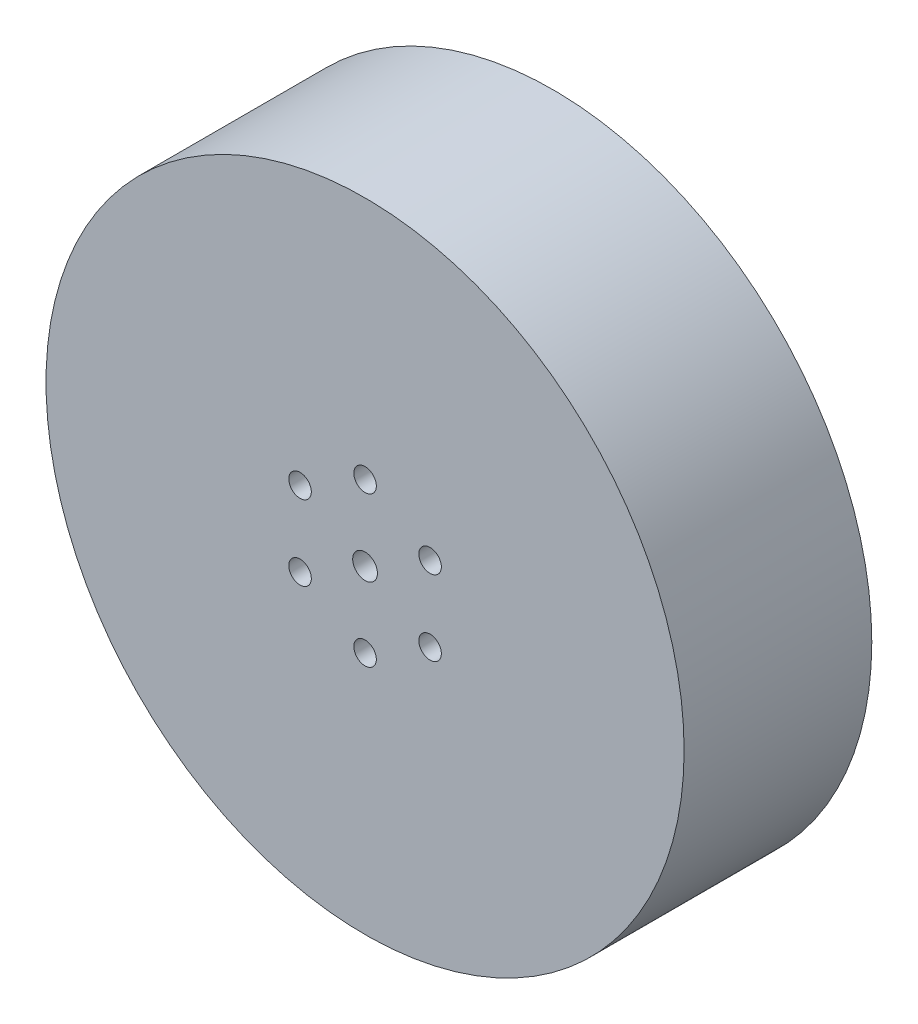
ISO-10303-21;
HEADER;
FILE_DESCRIPTION(('STEP AP214'),'2;1');
FILE_NAME('part.step','',(''),(''),'','','');
FILE_SCHEMA(('AUTOMOTIVE_DESIGN { 1 0 10303 214 1 1 1 1 }'));
ENDSEC;
DATA;
#1=APPLICATION_CONTEXT('core data for automotive mechanical design processes');
#2=APPLICATION_PROTOCOL_DEFINITION('international standard','automotive_design',2000,#1);
#3=PRODUCT_CONTEXT('',#1,'mechanical');
#4=PRODUCT('Part','Part','',(#3));
#5=PRODUCT_RELATED_PRODUCT_CATEGORY('part','',(#4));
#6=PRODUCT_DEFINITION_FORMATION('','',#4);
#7=PRODUCT_DEFINITION_CONTEXT('part definition',#1,'design');
#8=PRODUCT_DEFINITION('design','',#6,#7);
#9=PRODUCT_DEFINITION_SHAPE('','',#8);
#10=(LENGTH_UNIT() NAMED_UNIT(*) SI_UNIT(.MILLI.,.METRE.));
#11=(NAMED_UNIT(*) PLANE_ANGLE_UNIT() SI_UNIT($,.RADIAN.));
#12=(NAMED_UNIT(*) SI_UNIT($,.STERADIAN.) SOLID_ANGLE_UNIT());
#13=UNCERTAINTY_MEASURE_WITH_UNIT(LENGTH_MEASURE(1.E-05),#10,'distance_accuracy_value','');
#14=(GEOMETRIC_REPRESENTATION_CONTEXT(3) GLOBAL_UNCERTAINTY_ASSIGNED_CONTEXT((#13)) GLOBAL_UNIT_ASSIGNED_CONTEXT((#10,
#11,#12)) REPRESENTATION_CONTEXT('',''));
#15=CARTESIAN_POINT('',(0.,0.,0.));
#16=DIRECTION('',(0.,0.,1.));
#17=DIRECTION('',(1.,0.,0.));
#18=AXIS2_PLACEMENT_3D('',#15,#16,#17);
#19=CARTESIAN_POINT('',(0.,0.,0.));
#20=DIRECTION('',(0.,0.,1.));
#21=DIRECTION('',(1.,0.,0.));
#22=AXIS2_PLACEMENT_3D('',#19,#20,#21);
#23=PLANE('',#22);
#24=CARTESIAN_POINT('',(0.,0.,0.));
#25=DIRECTION('',(0.,0.,1.));
#26=DIRECTION('',(1.,0.,0.));
#27=AXIS2_PLACEMENT_3D('',#24,#25,#26);
#28=CIRCLE('',#27,42.5);
#29=CARTESIAN_POINT('',(42.5,0.,0.));
#30=VERTEX_POINT('',#29);
#31=EDGE_CURVE('E101',#30,#30,#28,.T.);
#32=ORIENTED_EDGE('',*,*,#31,.F.);
#33=EDGE_LOOP('',(#32));
#34=FACE_BOUND('',#33,.T.);
#35=CARTESIAN_POINT('',(0.,0.,0.));
#36=DIRECTION('',(0.,0.,1.));
#37=DIRECTION('',(1.,0.,0.));
#38=AXIS2_PLACEMENT_3D('',#35,#36,#37);
#39=CIRCLE('',#38,14.);
#40=CARTESIAN_POINT('',(14.,0.,0.));
#41=VERTEX_POINT('',#40);
#42=EDGE_CURVE('E11',#41,#41,#39,.F.);
#43=ORIENTED_EDGE('',*,*,#42,.F.);
#44=EDGE_LOOP('',(#43));
#45=FACE_BOUND('',#44,.T.);
#46=ADVANCED_FACE('F45',(#34,#45),#23,.F.);
#47=CARTESIAN_POINT('',(8.6602540378444,4.99999999999998,25.));
#48=DIRECTION('',(0.,0.,-1.));
#49=DIRECTION('',(-1.,0.,0.));
#50=AXIS2_PLACEMENT_3D('',#47,#48,#49);
#51=CYLINDRICAL_SURFACE('',#50,1.5);
#52=CARTESIAN_POINT('',(8.6602540378444,4.99999999999998,25.));
#53=DIRECTION('',(0.,0.,1.));
#54=DIRECTION('',(1.,0.,0.));
#55=AXIS2_PLACEMENT_3D('',#52,#53,#54);
#56=CIRCLE('',#55,1.5);
#57=CARTESIAN_POINT('',(10.1602540378444,4.99999999999998,25.));
#58=VERTEX_POINT('',#57);
#59=EDGE_CURVE('E122',#58,#58,#56,.T.);
#60=ORIENTED_EDGE('',*,*,#59,.T.);
#61=EDGE_LOOP('',(#60));
#62=FACE_BOUND('',#61,.T.);
#63=CARTESIAN_POINT('',(8.66025403784418,4.99999999999963,-2.));
#64=DIRECTION('',(0.,0.,-1.));
#65=DIRECTION('',(-1.,0.,0.));
#66=AXIS2_PLACEMENT_3D('',#63,#64,#65);
#67=CIRCLE('',#66,1.50000000000043);
#68=CARTESIAN_POINT('',(7.16025403784375,4.99999999999963,-2.));
#69=VERTEX_POINT('',#68);
#70=EDGE_CURVE('E67',#69,#69,#67,.T.);
#71=ORIENTED_EDGE('',*,*,#70,.T.);
#72=EDGE_LOOP('',(#71));
#73=FACE_BOUND('',#72,.T.);
#74=ADVANCED_FACE('F135',(#62,#73),#51,.F.);
#75=CARTESIAN_POINT('',(8.66025403784503,-4.99999999999963,25.));
#76=DIRECTION('',(0.,0.,-1.));
#77=DIRECTION('',(-1.,0.,0.));
#78=AXIS2_PLACEMENT_3D('',#75,#76,#77);
#79=CYLINDRICAL_SURFACE('',#78,1.50000000000055);
#80=CARTESIAN_POINT('',(8.66025403784503,-4.99999999999963,25.));
#81=DIRECTION('',(0.,0.,1.));
#82=DIRECTION('',(1.,0.,0.));
#83=AXIS2_PLACEMENT_3D('',#80,#81,#82);
#84=CIRCLE('',#83,1.50000000000055);
#85=CARTESIAN_POINT('',(10.1602540378456,-4.99999999999963,25.));
#86=VERTEX_POINT('',#85);
#87=EDGE_CURVE('E118',#86,#86,#84,.T.);
#88=ORIENTED_EDGE('',*,*,#87,.T.);
#89=EDGE_LOOP('',(#88));
#90=FACE_BOUND('',#89,.T.);
#91=CARTESIAN_POINT('',(8.66025403784375,-5.00000000000037,-2.));
#92=DIRECTION('',(0.,0.,-1.));
#93=DIRECTION('',(-1.,0.,0.));
#94=AXIS2_PLACEMENT_3D('',#91,#92,#93);
#95=CIRCLE('',#94,1.50000000000081);
#96=CARTESIAN_POINT('',(7.16025403784294,-5.00000000000037,-2.));
#97=VERTEX_POINT('',#96);
#98=EDGE_CURVE('E73',#97,#97,#95,.T.);
#99=ORIENTED_EDGE('',*,*,#98,.T.);
#100=EDGE_LOOP('',(#99));
#101=FACE_BOUND('',#100,.T.);
#102=ADVANCED_FACE('F160',(#90,#101),#79,.F.);
#103=CARTESIAN_POINT('',(8.48977342514678E-13,-10.,25.));
#104=DIRECTION('',(0.,0.,-1.));
#105=DIRECTION('',(-1.,0.,0.));
#106=AXIS2_PLACEMENT_3D('',#103,#104,#105);
#107=CYLINDRICAL_SURFACE('',#106,1.50000000000088);
#108=CARTESIAN_POINT('',(8.48977342514678E-13,-10.,25.));
#109=DIRECTION('',(0.,0.,1.));
#110=DIRECTION('',(1.,0.,0.));
#111=AXIS2_PLACEMENT_3D('',#108,#109,#110);
#112=CIRCLE('',#111,1.50000000000088);
#113=CARTESIAN_POINT('',(1.50000000000173,-10.,25.));
#114=VERTEX_POINT('',#113);
#115=EDGE_CURVE('E114',#114,#114,#112,.T.);
#116=ORIENTED_EDGE('',*,*,#115,.T.);
#117=EDGE_LOOP('',(#116));
#118=FACE_BOUND('',#117,.T.);
#119=CARTESIAN_POINT('',(-8.48977342514678E-13,-10.,-2.));
#120=DIRECTION('',(0.,0.,-1.));
#121=DIRECTION('',(-1.,0.,0.));
#122=AXIS2_PLACEMENT_3D('',#119,#120,#121);
#123=CIRCLE('',#122,1.50000000000088);
#124=CARTESIAN_POINT('',(-1.50000000000173,-10.,-2.));
#125=VERTEX_POINT('',#124);
#126=EDGE_CURVE('E81',#125,#125,#123,.T.);
#127=ORIENTED_EDGE('',*,*,#126,.T.);
#128=EDGE_LOOP('',(#127));
#129=FACE_BOUND('',#128,.T.);
#130=ADVANCED_FACE('F164',(#118,#129),#107,.F.);
#131=CARTESIAN_POINT('',(-8.66025403784375,-5.00000000000037,25.));
#132=DIRECTION('',(0.,0.,-1.));
#133=DIRECTION('',(-1.,0.,0.));
#134=AXIS2_PLACEMENT_3D('',#131,#132,#133);
#135=CYLINDRICAL_SURFACE('',#134,1.50000000000081);
#136=CARTESIAN_POINT('',(-8.66025403784375,-5.00000000000037,25.));
#137=DIRECTION('',(0.,0.,1.));
#138=DIRECTION('',(1.,0.,0.));
#139=AXIS2_PLACEMENT_3D('',#136,#137,#138);
#140=CIRCLE('',#139,1.50000000000081);
#141=CARTESIAN_POINT('',(-7.16025403784294,-5.00000000000037,25.));
#142=VERTEX_POINT('',#141);
#143=EDGE_CURVE('E110',#142,#142,#140,.T.);
#144=ORIENTED_EDGE('',*,*,#143,.T.);
#145=EDGE_LOOP('',(#144));
#146=FACE_BOUND('',#145,.T.);
#147=CARTESIAN_POINT('',(-8.66025403784503,-4.99999999999963,-2.));
#148=DIRECTION('',(0.,0.,-1.));
#149=DIRECTION('',(-1.,0.,0.));
#150=AXIS2_PLACEMENT_3D('',#147,#148,#149);
#151=CIRCLE('',#150,1.50000000000055);
#152=CARTESIAN_POINT('',(-10.1602540378456,-4.99999999999963,-2.));
#153=VERTEX_POINT('',#152);
#154=EDGE_CURVE('E85',#153,#153,#151,.T.);
#155=ORIENTED_EDGE('',*,*,#154,.T.);
#156=EDGE_LOOP('',(#155));
#157=FACE_BOUND('',#156,.T.);
#158=ADVANCED_FACE('F168',(#146,#157),#135,.F.);
#159=CARTESIAN_POINT('',(-8.66025403784433,5.0000000000001,25.));
#160=DIRECTION('',(0.,0.,-1.));
#161=DIRECTION('',(-1.,0.,0.));
#162=AXIS2_PLACEMENT_3D('',#159,#160,#161);
#163=CYLINDRICAL_SURFACE('',#162,1.5);
#164=CARTESIAN_POINT('',(-8.66025403784433,5.0000000000001,25.));
#165=DIRECTION('',(0.,0.,1.));
#166=DIRECTION('',(1.,0.,0.));
#167=AXIS2_PLACEMENT_3D('',#164,#165,#166);
#168=CIRCLE('',#167,1.5);
#169=CARTESIAN_POINT('',(-7.16025403784433,5.0000000000001,25.));
#170=VERTEX_POINT('',#169);
#171=EDGE_CURVE('E106',#170,#170,#168,.T.);
#172=ORIENTED_EDGE('',*,*,#171,.T.);
#173=EDGE_LOOP('',(#172));
#174=FACE_BOUND('',#173,.T.);
#175=CARTESIAN_POINT('',(-8.6602540378446,5.00000000000037,-2.));
#176=DIRECTION('',(0.,0.,-1.));
#177=DIRECTION('',(-1.,0.,0.));
#178=AXIS2_PLACEMENT_3D('',#175,#176,#177);
#179=CIRCLE('',#178,1.50000000000012);
#180=CARTESIAN_POINT('',(-10.1602540378447,5.00000000000037,-2.));
#181=VERTEX_POINT('',#180);
#182=EDGE_CURVE('E89',#181,#181,#179,.T.);
#183=ORIENTED_EDGE('',*,*,#182,.T.);
#184=EDGE_LOOP('',(#183));
#185=FACE_BOUND('',#184,.T.);
#186=ADVANCED_FACE('F171',(#174,#185),#163,.F.);
#187=CARTESIAN_POINT('',(0.,0.,25.));
#188=DIRECTION('',(0.,0.,-1.));
#189=DIRECTION('',(-1.,0.,0.));
#190=AXIS2_PLACEMENT_3D('',#187,#188,#189);
#191=CYLINDRICAL_SURFACE('',#190,42.5);
#192=CARTESIAN_POINT('',(0.,0.,25.));
#193=DIRECTION('',(0.,0.,1.));
#194=DIRECTION('',(1.,0.,0.));
#195=AXIS2_PLACEMENT_3D('',#192,#193,#194);
#196=CIRCLE('',#195,42.5);
#197=CARTESIAN_POINT('',(42.5,0.,25.));
#198=VERTEX_POINT('',#197);
#199=EDGE_CURVE('E102',#198,#198,#196,.T.);
#200=ORIENTED_EDGE('',*,*,#199,.F.);
#201=EDGE_LOOP('',(#200));
#202=FACE_BOUND('',#201,.T.);
#203=ORIENTED_EDGE('',*,*,#31,.T.);
#204=EDGE_LOOP('',(#203));
#205=FACE_BOUND('',#204,.T.);
#206=ADVANCED_FACE('F47',(#202,#205),#191,.T.);
#207=CARTESIAN_POINT('',(0.,10.,25.));
#208=DIRECTION('',(0.,0.,-1.));
#209=DIRECTION('',(-1.,0.,0.));
#210=AXIS2_PLACEMENT_3D('',#207,#208,#209);
#211=CYLINDRICAL_SURFACE('',#210,1.5);
#212=CARTESIAN_POINT('',(0.,10.,25.));
#213=DIRECTION('',(0.,0.,1.));
#214=DIRECTION('',(1.,0.,0.));
#215=AXIS2_PLACEMENT_3D('',#212,#213,#214);
#216=CIRCLE('',#215,1.5);
#217=CARTESIAN_POINT('',(1.5,10.,25.));
#218=VERTEX_POINT('',#217);
#219=EDGE_CURVE('E53',#218,#218,#216,.T.);
#220=ORIENTED_EDGE('',*,*,#219,.T.);
#221=EDGE_LOOP('',(#220));
#222=FACE_BOUND('',#221,.T.);
#223=CARTESIAN_POINT('',(0.,10.,-2.));
#224=DIRECTION('',(0.,0.,-1.));
#225=DIRECTION('',(-1.,0.,0.));
#226=AXIS2_PLACEMENT_3D('',#223,#224,#225);
#227=CIRCLE('',#226,1.5);
#228=CARTESIAN_POINT('',(-1.5,10.,-2.));
#229=VERTEX_POINT('',#228);
#230=EDGE_CURVE('E93',#229,#229,#227,.T.);
#231=ORIENTED_EDGE('',*,*,#230,.T.);
#232=EDGE_LOOP('',(#231));
#233=FACE_BOUND('',#232,.T.);
#234=ADVANCED_FACE('F152',(#222,#233),#211,.F.);
#235=CARTESIAN_POINT('',(0.,0.,25.));
#236=DIRECTION('',(0.,0.,1.));
#237=DIRECTION('',(1.,0.,0.));
#238=AXIS2_PLACEMENT_3D('',#235,#236,#237);
#239=PLANE('',#238);
#240=CARTESIAN_POINT('',(0.,0.,25.));
#241=DIRECTION('',(0.,0.,1.));
#242=DIRECTION('',(1.,0.,0.));
#243=AXIS2_PLACEMENT_3D('',#240,#241,#242);
#244=CIRCLE('',#243,1.65);
#245=CARTESIAN_POINT('',(1.65,0.,25.));
#246=VERTEX_POINT('',#245);
#247=EDGE_CURVE('E68',#246,#246,#244,.T.);
#248=ORIENTED_EDGE('',*,*,#247,.F.);
#249=EDGE_LOOP('',(#248));
#250=FACE_BOUND('',#249,.T.);
#251=ORIENTED_EDGE('',*,*,#199,.T.);
#252=EDGE_LOOP('',(#251));
#253=FACE_BOUND('',#252,.T.);
#254=ORIENTED_EDGE('',*,*,#171,.F.);
#255=EDGE_LOOP('',(#254));
#256=FACE_BOUND('',#255,.T.);
#257=ORIENTED_EDGE('',*,*,#143,.F.);
#258=EDGE_LOOP('',(#257));
#259=FACE_BOUND('',#258,.T.);
#260=ORIENTED_EDGE('',*,*,#115,.F.);
#261=EDGE_LOOP('',(#260));
#262=FACE_BOUND('',#261,.T.);
#263=ORIENTED_EDGE('',*,*,#87,.F.);
#264=EDGE_LOOP('',(#263));
#265=FACE_BOUND('',#264,.T.);
#266=ORIENTED_EDGE('',*,*,#59,.F.);
#267=EDGE_LOOP('',(#266));
#268=FACE_BOUND('',#267,.T.);
#269=ORIENTED_EDGE('',*,*,#219,.F.);
#270=EDGE_LOOP('',(#269));
#271=FACE_BOUND('',#270,.T.);
#272=ADVANCED_FACE('F146',(#250,#253,#256,#259,#262,#265,#268,#271),#239,.T.);
#273=CARTESIAN_POINT('',(0.,0.,-2.));
#274=DIRECTION('',(0.,0.,-1.));
#275=DIRECTION('',(-1.,0.,0.));
#276=AXIS2_PLACEMENT_3D('',#273,#274,#275);
#277=PLANE('',#276);
#278=ORIENTED_EDGE('',*,*,#98,.F.);
#279=EDGE_LOOP('',(#278));
#280=FACE_BOUND('',#279,.T.);
#281=ORIENTED_EDGE('',*,*,#154,.F.);
#282=EDGE_LOOP('',(#281));
#283=FACE_BOUND('',#282,.T.);
#284=ORIENTED_EDGE('',*,*,#230,.F.);
#285=EDGE_LOOP('',(#284));
#286=FACE_BOUND('',#285,.T.);
#287=CARTESIAN_POINT('',(0.,0.,-2.));
#288=DIRECTION('',(0.,0.,-1.));
#289=DIRECTION('',(-1.,0.,0.));
#290=AXIS2_PLACEMENT_3D('',#287,#288,#289);
#291=CIRCLE('',#290,14.);
#292=CARTESIAN_POINT('',(-14.,0.,-2.));
#293=VERTEX_POINT('',#292);
#294=EDGE_CURVE('E97',#293,#293,#291,.T.);
#295=ORIENTED_EDGE('',*,*,#294,.T.);
#296=EDGE_LOOP('',(#295));
#297=FACE_BOUND('',#296,.T.);
#298=ORIENTED_EDGE('',*,*,#182,.F.);
#299=EDGE_LOOP('',(#298));
#300=FACE_BOUND('',#299,.T.);
#301=ORIENTED_EDGE('',*,*,#126,.F.);
#302=EDGE_LOOP('',(#301));
#303=FACE_BOUND('',#302,.T.);
#304=ORIENTED_EDGE('',*,*,#70,.F.);
#305=EDGE_LOOP('',(#304));
#306=FACE_BOUND('',#305,.T.);
#307=ADVANCED_FACE('F140',(#280,#283,#286,#297,#300,#303,#306),#277,.T.);
#308=CARTESIAN_POINT('',(0.,0.,-2.));
#309=DIRECTION('',(0.,0.,1.));
#310=DIRECTION('',(1.,0.,0.));
#311=AXIS2_PLACEMENT_3D('',#308,#309,#310);
#312=CYLINDRICAL_SURFACE('',#311,14.);
#313=ORIENTED_EDGE('',*,*,#294,.F.);
#314=EDGE_LOOP('',(#313));
#315=FACE_BOUND('',#314,.T.);
#316=ORIENTED_EDGE('',*,*,#42,.T.);
#317=EDGE_LOOP('',(#316));
#318=FACE_BOUND('',#317,.T.);
#319=ADVANCED_FACE('F60',(#315,#318),#312,.T.);
#320=CARTESIAN_POINT('',(0.,0.,20.));
#321=DIRECTION('',(0.,0.,1.));
#322=DIRECTION('',(1.,0.,0.));
#323=AXIS2_PLACEMENT_3D('',#320,#321,#322);
#324=CONICAL_SURFACE('',#323,1.65,1.02974425867665);
#325=CARTESIAN_POINT('',(0.,0.,19.0085799786045));
#326=VERTEX_POINT('',#325);
#327=VERTEX_LOOP('',#326);
#328=FACE_BOUND('',#327,.T.);
#329=CARTESIAN_POINT('',(0.,0.,20.));
#330=DIRECTION('',(0.,0.,1.));
#331=DIRECTION('',(1.,0.,0.));
#332=AXIS2_PLACEMENT_3D('',#329,#330,#331);
#333=CIRCLE('',#332,1.65);
#334=CARTESIAN_POINT('',(1.65,0.,20.));
#335=VERTEX_POINT('',#334);
#336=EDGE_CURVE('E64',#335,#335,#333,.T.);
#337=ORIENTED_EDGE('',*,*,#336,.T.);
#338=EDGE_LOOP('',(#337));
#339=FACE_BOUND('',#338,.T.);
#340=ADVANCED_FACE('F56',(#328,#339),#324,.F.);
#341=CARTESIAN_POINT('',(0.,0.,25.));
#342=DIRECTION('',(0.,0.,1.));
#343=DIRECTION('',(1.,0.,0.));
#344=AXIS2_PLACEMENT_3D('',#341,#342,#343);
#345=CYLINDRICAL_SURFACE('',#344,1.65);
#346=ORIENTED_EDGE('',*,*,#336,.F.);
#347=EDGE_LOOP('',(#346));
#348=FACE_BOUND('',#347,.T.);
#349=ORIENTED_EDGE('',*,*,#247,.T.);
#350=EDGE_LOOP('',(#349));
#351=FACE_BOUND('',#350,.T.);
#352=ADVANCED_FACE('F59',(#348,#351),#345,.F.);
#353=CLOSED_SHELL('',(#46,#74,#102,#130,#158,#186,#206,#234,#272,#307,#319,#340,#352));
#354=MANIFOLD_SOLID_BREP('B2',#353);
#355=ADVANCED_BREP_SHAPE_REPRESENTATION('',(#18,#354),#14);
#356=SHAPE_DEFINITION_REPRESENTATION(#9,#355);
ENDSEC;
END-ISO-10303-21;
